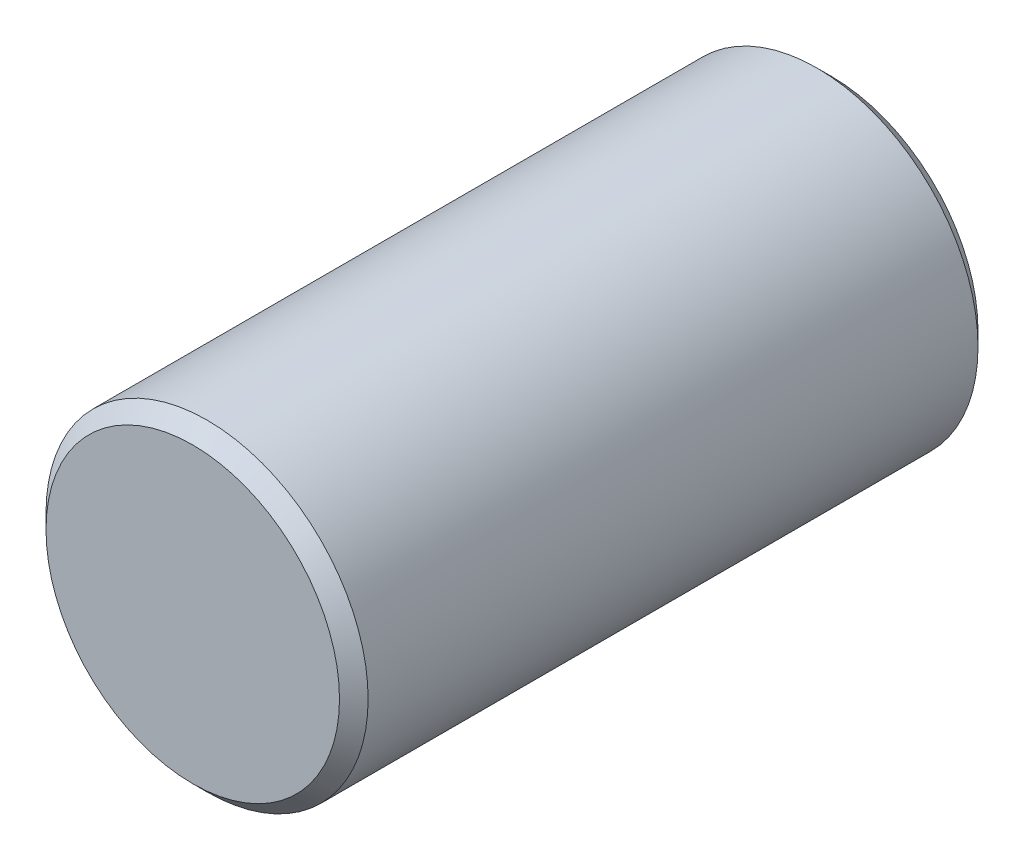
ISO-10303-21;
HEADER;
FILE_DESCRIPTION(('STEP AP214'),'2;1');
FILE_NAME('part.step','',(''),(''),'','','');
FILE_SCHEMA(('AUTOMOTIVE_DESIGN { 1 0 10303 214 1 1 1 1 }'));
ENDSEC;
DATA;
#1=APPLICATION_CONTEXT('core data for automotive mechanical design processes');
#2=APPLICATION_PROTOCOL_DEFINITION('international standard','automotive_design',2000,#1);
#3=PRODUCT_CONTEXT('',#1,'mechanical');
#4=PRODUCT('Part','Part','',(#3));
#5=PRODUCT_RELATED_PRODUCT_CATEGORY('part','',(#4));
#6=PRODUCT_DEFINITION_FORMATION('','',#4);
#7=PRODUCT_DEFINITION_CONTEXT('part definition',#1,'design');
#8=PRODUCT_DEFINITION('design','',#6,#7);
#9=PRODUCT_DEFINITION_SHAPE('','',#8);
#10=(LENGTH_UNIT() NAMED_UNIT(*) SI_UNIT(.MILLI.,.METRE.));
#11=(NAMED_UNIT(*) PLANE_ANGLE_UNIT() SI_UNIT($,.RADIAN.));
#12=(NAMED_UNIT(*) SI_UNIT($,.STERADIAN.) SOLID_ANGLE_UNIT());
#13=UNCERTAINTY_MEASURE_WITH_UNIT(LENGTH_MEASURE(1.E-05),#10,'distance_accuracy_value','');
#14=(GEOMETRIC_REPRESENTATION_CONTEXT(3) GLOBAL_UNCERTAINTY_ASSIGNED_CONTEXT((#13)) GLOBAL_UNIT_ASSIGNED_CONTEXT((#10,
#11,#12)) REPRESENTATION_CONTEXT('',''));
#15=CARTESIAN_POINT('',(0.,0.,0.));
#16=DIRECTION('',(0.,0.,1.));
#17=DIRECTION('',(1.,0.,0.));
#18=AXIS2_PLACEMENT_3D('',#15,#16,#17);
#19=CARTESIAN_POINT('',(0.,0.,44.6));
#20=DIRECTION('',(0.,0.,-1.));
#21=DIRECTION('',(-1.,0.,0.));
#22=AXIS2_PLACEMENT_3D('',#19,#20,#21);
#23=CYLINDRICAL_SURFACE('',#22,11.25);
#24=CARTESIAN_POINT('',(0.,0.,43.6));
#25=DIRECTION('',(0.,0.,1.));
#26=DIRECTION('',(1.,0.,0.));
#27=AXIS2_PLACEMENT_3D('',#24,#25,#26);
#28=CIRCLE('',#27,11.25);
#29=CARTESIAN_POINT('',(11.25,0.,43.6));
#30=VERTEX_POINT('',#29);
#31=EDGE_CURVE('E37',#30,#30,#28,.F.);
#32=ORIENTED_EDGE('',*,*,#31,.T.);
#33=EDGE_LOOP('',(#32));
#34=FACE_BOUND('',#33,.T.);
#35=CARTESIAN_POINT('',(0.,0.,1.));
#36=DIRECTION('',(0.,0.,1.));
#37=DIRECTION('',(1.,0.,0.));
#38=AXIS2_PLACEMENT_3D('',#35,#36,#37);
#39=CIRCLE('',#38,11.25);
#40=CARTESIAN_POINT('',(11.25,0.,1.));
#41=VERTEX_POINT('',#40);
#42=EDGE_CURVE('E41',#41,#41,#39,.T.);
#43=ORIENTED_EDGE('',*,*,#42,.T.);
#44=EDGE_LOOP('',(#43));
#45=FACE_BOUND('',#44,.T.);
#46=ADVANCED_FACE('F31',(#34,#45),#23,.T.);
#47=CARTESIAN_POINT('',(0.,0.,44.6));
#48=DIRECTION('',(0.,0.,1.));
#49=DIRECTION('',(1.,0.,0.));
#50=AXIS2_PLACEMENT_3D('',#47,#48,#49);
#51=PLANE('',#50);
#52=CARTESIAN_POINT('',(0.,0.,44.6));
#53=DIRECTION('',(0.,0.,1.));
#54=DIRECTION('',(1.,0.,0.));
#55=AXIS2_PLACEMENT_3D('',#52,#53,#54);
#56=CIRCLE('',#55,10.25);
#57=CARTESIAN_POINT('',(10.25,0.,44.6));
#58=VERTEX_POINT('',#57);
#59=EDGE_CURVE('E45',#58,#58,#56,.T.);
#60=ORIENTED_EDGE('',*,*,#59,.T.);
#61=EDGE_LOOP('',(#60));
#62=FACE_BOUND('',#61,.T.);
#63=ADVANCED_FACE('F51',(#62),#51,.T.);
#64=CARTESIAN_POINT('',(0.,0.,0.));
#65=DIRECTION('',(0.,0.,1.));
#66=DIRECTION('',(1.,0.,0.));
#67=AXIS2_PLACEMENT_3D('',#64,#65,#66);
#68=PLANE('',#67);
#69=CARTESIAN_POINT('',(0.,0.,0.));
#70=DIRECTION('',(0.,0.,1.));
#71=DIRECTION('',(1.,0.,0.));
#72=AXIS2_PLACEMENT_3D('',#69,#70,#71);
#73=CIRCLE('',#72,10.25);
#74=CARTESIAN_POINT('',(10.25,0.,0.));
#75=VERTEX_POINT('',#74);
#76=EDGE_CURVE('E10',#75,#75,#73,.F.);
#77=ORIENTED_EDGE('',*,*,#76,.T.);
#78=EDGE_LOOP('',(#77));
#79=FACE_BOUND('',#78,.T.);
#80=ADVANCED_FACE('F56',(#79),#68,.F.);
#81=CARTESIAN_POINT('',(0.,0.,44.6));
#82=DIRECTION('',(0.,0.,-1.));
#83=DIRECTION('',(-1.,0.,0.));
#84=AXIS2_PLACEMENT_3D('',#81,#82,#83);
#85=CONICAL_SURFACE('',#84,10.25,0.785398163397447);
#86=ORIENTED_EDGE('',*,*,#31,.F.);
#87=EDGE_LOOP('',(#86));
#88=FACE_BOUND('',#87,.T.);
#89=ORIENTED_EDGE('',*,*,#59,.F.);
#90=EDGE_LOOP('',(#89));
#91=FACE_BOUND('',#90,.T.);
#92=ADVANCED_FACE('F53',(#88,#91),#85,.T.);
#93=CARTESIAN_POINT('',(0.,0.,1.));
#94=DIRECTION('',(0.,0.,1.));
#95=DIRECTION('',(1.,0.,0.));
#96=AXIS2_PLACEMENT_3D('',#93,#94,#95);
#97=CONICAL_SURFACE('',#96,11.25,0.78539816339745);
#98=ORIENTED_EDGE('',*,*,#76,.F.);
#99=EDGE_LOOP('',(#98));
#100=FACE_BOUND('',#99,.T.);
#101=ORIENTED_EDGE('',*,*,#42,.F.);
#102=EDGE_LOOP('',(#101));
#103=FACE_BOUND('',#102,.T.);
#104=ADVANCED_FACE('F55',(#100,#103),#97,.T.);
#105=CLOSED_SHELL('',(#46,#63,#80,#92,#104));
#106=MANIFOLD_SOLID_BREP('B2',#105);
#107=ADVANCED_BREP_SHAPE_REPRESENTATION('',(#18,#106),#14);
#108=SHAPE_DEFINITION_REPRESENTATION(#9,#107);
ENDSEC;
END-ISO-10303-21;
